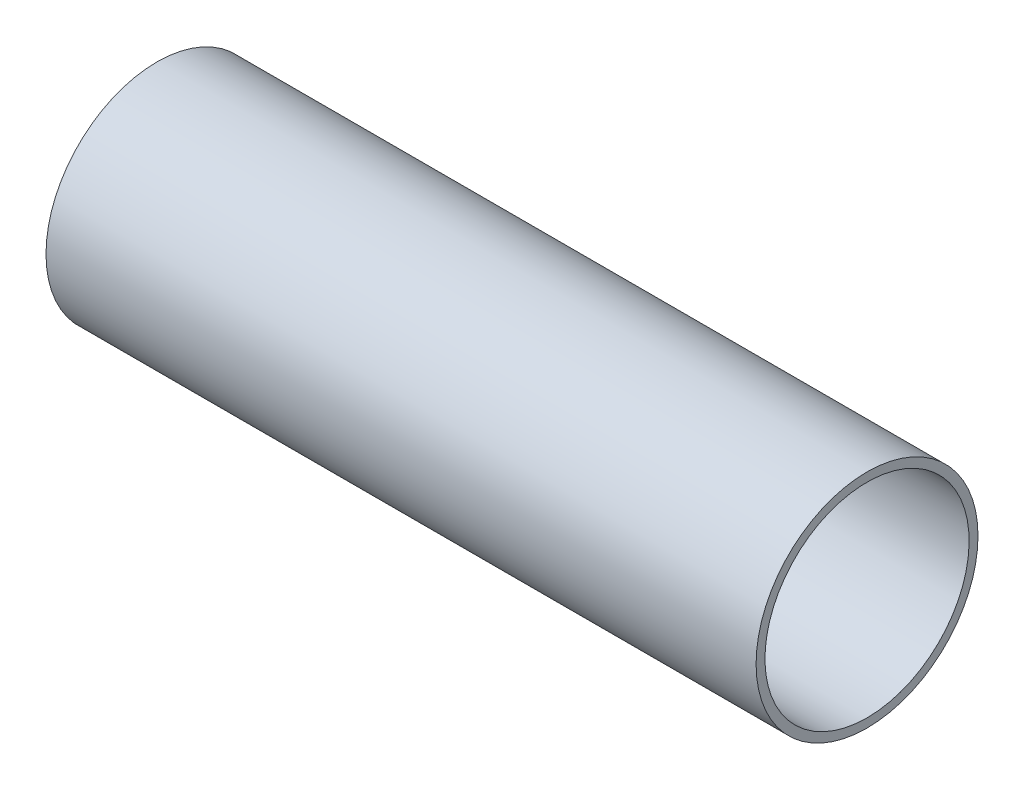
ISO-10303-21;
HEADER;
FILE_DESCRIPTION(('STEP AP214'),'2;1');
FILE_NAME('part.step','',(''),(''),'','','');
FILE_SCHEMA(('AUTOMOTIVE_DESIGN { 1 0 10303 214 1 1 1 1 }'));
ENDSEC;
DATA;
#1=APPLICATION_CONTEXT('core data for automotive mechanical design processes');
#2=APPLICATION_PROTOCOL_DEFINITION('international standard','automotive_design',2000,#1);
#3=PRODUCT_CONTEXT('',#1,'mechanical');
#4=PRODUCT('Part','Part','',(#3));
#5=PRODUCT_RELATED_PRODUCT_CATEGORY('part','',(#4));
#6=PRODUCT_DEFINITION_FORMATION('','',#4);
#7=PRODUCT_DEFINITION_CONTEXT('part definition',#1,'design');
#8=PRODUCT_DEFINITION('design','',#6,#7);
#9=PRODUCT_DEFINITION_SHAPE('','',#8);
#10=(LENGTH_UNIT() NAMED_UNIT(*) SI_UNIT(.MILLI.,.METRE.));
#11=(NAMED_UNIT(*) PLANE_ANGLE_UNIT() SI_UNIT($,.RADIAN.));
#12=(NAMED_UNIT(*) SI_UNIT($,.STERADIAN.) SOLID_ANGLE_UNIT());
#13=UNCERTAINTY_MEASURE_WITH_UNIT(LENGTH_MEASURE(1.E-05),#10,'distance_accuracy_value','');
#14=(GEOMETRIC_REPRESENTATION_CONTEXT(3) GLOBAL_UNCERTAINTY_ASSIGNED_CONTEXT((#13)) GLOBAL_UNIT_ASSIGNED_CONTEXT((#10,
#11,#12)) REPRESENTATION_CONTEXT('',''));
#15=CARTESIAN_POINT('',(0.,0.,0.));
#16=DIRECTION('',(0.,0.,1.));
#17=DIRECTION('',(1.,0.,0.));
#18=AXIS2_PLACEMENT_3D('',#15,#16,#17);
#19=CARTESIAN_POINT('',(400.,655.,0.));
#20=DIRECTION('',(-1.,0.,0.));
#21=DIRECTION('',(0.,-1.,0.));
#22=AXIS2_PLACEMENT_3D('',#19,#20,#21);
#23=CYLINDRICAL_SURFACE('',#22,12.5);
#24=CARTESIAN_POINT('',(400.,655.,0.));
#25=DIRECTION('',(-1.,0.,0.));
#26=DIRECTION('',(0.,-1.,0.));
#27=AXIS2_PLACEMENT_3D('',#24,#25,#26);
#28=CIRCLE('',#27,12.5);
#29=CARTESIAN_POINT('',(400.,642.5,0.));
#30=VERTEX_POINT('',#29);
#31=EDGE_CURVE('E10',#30,#30,#28,.T.);
#32=ORIENTED_EDGE('',*,*,#31,.T.);
#33=EDGE_LOOP('',(#32));
#34=FACE_BOUND('',#33,.T.);
#35=CARTESIAN_POINT('',(320.,655.,0.));
#36=DIRECTION('',(-1.,0.,0.));
#37=DIRECTION('',(0.,-1.,0.));
#38=AXIS2_PLACEMENT_3D('',#35,#36,#37);
#39=CIRCLE('',#38,12.5);
#40=CARTESIAN_POINT('',(320.,642.5,0.));
#41=VERTEX_POINT('',#40);
#42=EDGE_CURVE('E38',#41,#41,#39,.T.);
#43=ORIENTED_EDGE('',*,*,#42,.F.);
#44=EDGE_LOOP('',(#43));
#45=FACE_BOUND('',#44,.T.);
#46=ADVANCED_FACE('F35',(#34,#45),#23,.T.);
#47=CARTESIAN_POINT('',(400.,655.,0.));
#48=DIRECTION('',(-1.,0.,0.));
#49=DIRECTION('',(0.,-1.,0.));
#50=AXIS2_PLACEMENT_3D('',#47,#48,#49);
#51=PLANE('',#50);
#52=CARTESIAN_POINT('',(400.,655.,0.));
#53=DIRECTION('',(-1.,0.,0.));
#54=DIRECTION('',(0.,-1.,0.));
#55=AXIS2_PLACEMENT_3D('',#52,#53,#54);
#56=CIRCLE('',#55,11.5);
#57=CARTESIAN_POINT('',(400.,643.5,0.));
#58=VERTEX_POINT('',#57);
#59=EDGE_CURVE('E45',#58,#58,#56,.T.);
#60=ORIENTED_EDGE('',*,*,#59,.T.);
#61=EDGE_LOOP('',(#60));
#62=FACE_BOUND('',#61,.T.);
#63=ORIENTED_EDGE('',*,*,#31,.F.);
#64=EDGE_LOOP('',(#63));
#65=FACE_BOUND('',#64,.T.);
#66=ADVANCED_FACE('F53',(#62,#65),#51,.F.);
#67=CARTESIAN_POINT('',(320.,655.,0.));
#68=DIRECTION('',(-1.,0.,0.));
#69=DIRECTION('',(0.,-1.,0.));
#70=AXIS2_PLACEMENT_3D('',#67,#68,#69);
#71=PLANE('',#70);
#72=CARTESIAN_POINT('',(320.,655.,0.));
#73=DIRECTION('',(-1.,0.,0.));
#74=DIRECTION('',(0.,-1.,0.));
#75=AXIS2_PLACEMENT_3D('',#72,#73,#74);
#76=CIRCLE('',#75,11.5);
#77=CARTESIAN_POINT('',(320.,643.5,0.));
#78=VERTEX_POINT('',#77);
#79=EDGE_CURVE('E47',#78,#78,#76,.T.);
#80=ORIENTED_EDGE('',*,*,#79,.F.);
#81=EDGE_LOOP('',(#80));
#82=FACE_BOUND('',#81,.T.);
#83=ORIENTED_EDGE('',*,*,#42,.T.);
#84=EDGE_LOOP('',(#83));
#85=FACE_BOUND('',#84,.T.);
#86=ADVANCED_FACE('F59',(#82,#85),#71,.T.);
#87=CARTESIAN_POINT('',(400.,655.,0.));
#88=DIRECTION('',(-1.,0.,0.));
#89=DIRECTION('',(0.,-1.,0.));
#90=AXIS2_PLACEMENT_3D('',#87,#88,#89);
#91=CYLINDRICAL_SURFACE('',#90,11.5);
#92=ORIENTED_EDGE('',*,*,#59,.F.);
#93=EDGE_LOOP('',(#92));
#94=FACE_BOUND('',#93,.T.);
#95=ORIENTED_EDGE('',*,*,#79,.T.);
#96=EDGE_LOOP('',(#95));
#97=FACE_BOUND('',#96,.T.);
#98=ADVANCED_FACE('F56',(#94,#97),#91,.F.);
#99=CLOSED_SHELL('',(#46,#66,#86,#98));
#100=MANIFOLD_SOLID_BREP('B2',#99);
#101=ADVANCED_BREP_SHAPE_REPRESENTATION('',(#18,#100),#14);
#102=SHAPE_DEFINITION_REPRESENTATION(#9,#101);
ENDSEC;
END-ISO-10303-21;
